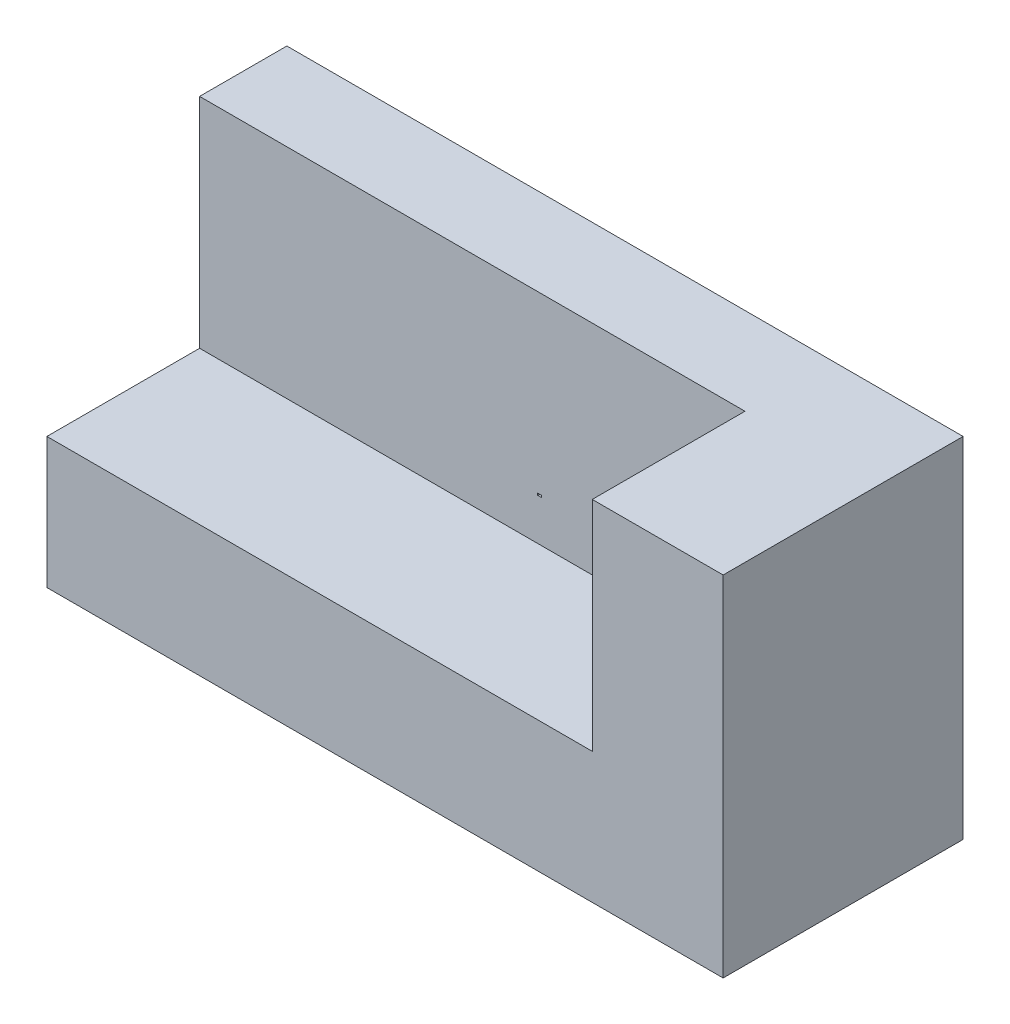
ISO-10303-21;
HEADER;
FILE_DESCRIPTION(('STEP AP214'),'2;1');
FILE_NAME('part.step','',(''),(''),'','','');
FILE_SCHEMA(('AUTOMOTIVE_DESIGN { 1 0 10303 214 1 1 1 1 }'));
ENDSEC;
DATA;
#1=APPLICATION_CONTEXT('core data for automotive mechanical design processes');
#2=APPLICATION_PROTOCOL_DEFINITION('international standard','automotive_design',2000,#1);
#3=PRODUCT_CONTEXT('',#1,'mechanical');
#4=PRODUCT('Part','Part','',(#3));
#5=PRODUCT_RELATED_PRODUCT_CATEGORY('part','',(#4));
#6=PRODUCT_DEFINITION_FORMATION('','',#4);
#7=PRODUCT_DEFINITION_CONTEXT('part definition',#1,'design');
#8=PRODUCT_DEFINITION('design','',#6,#7);
#9=PRODUCT_DEFINITION_SHAPE('','',#8);
#10=(LENGTH_UNIT() NAMED_UNIT(*) SI_UNIT(.MILLI.,.METRE.));
#11=(NAMED_UNIT(*) PLANE_ANGLE_UNIT() SI_UNIT($,.RADIAN.));
#12=(NAMED_UNIT(*) SI_UNIT($,.STERADIAN.) SOLID_ANGLE_UNIT());
#13=UNCERTAINTY_MEASURE_WITH_UNIT(LENGTH_MEASURE(1.E-05),#10,'distance_accuracy_value','');
#14=(GEOMETRIC_REPRESENTATION_CONTEXT(3) GLOBAL_UNCERTAINTY_ASSIGNED_CONTEXT((#13)) GLOBAL_UNIT_ASSIGNED_CONTEXT((#10,
#11,#12)) REPRESENTATION_CONTEXT('',''));
#15=CARTESIAN_POINT('',(0.,0.,0.));
#16=DIRECTION('',(0.,0.,1.));
#17=DIRECTION('',(1.,0.,0.));
#18=AXIS2_PLACEMENT_3D('',#15,#16,#17);
#19=CARTESIAN_POINT('',(0.,0.,22.));
#20=DIRECTION('',(0.,0.,-1.));
#21=DIRECTION('',(-1.,0.,0.));
#22=AXIS2_PLACEMENT_3D('',#19,#20,#21);
#23=PLANE('',#22);
#24=DIRECTION('',(1.,0.,0.));
#25=VECTOR('',#24,1.);
#26=CARTESIAN_POINT('',(0.,-4.00000000000001,22.));
#27=LINE('',#26,#25);
#28=CARTESIAN_POINT('',(-31.,-4.00000000000001,22.));
#29=VERTEX_POINT('',#28);
#30=CARTESIAN_POINT('',(19.,-4.00000000000001,22.));
#31=VERTEX_POINT('',#30);
#32=EDGE_CURVE('E210',#29,#31,#27,.T.);
#33=ORIENTED_EDGE('',*,*,#32,.F.);
#34=DIRECTION('',(0.,-1.,0.));
#35=VECTOR('',#34,1.);
#36=CARTESIAN_POINT('',(-31.,-16.,22.));
#37=LINE('',#36,#35);
#38=CARTESIAN_POINT('',(-31.,-16.,22.));
#39=VERTEX_POINT('',#38);
#40=EDGE_CURVE('E133',#29,#39,#37,.T.);
#41=ORIENTED_EDGE('',*,*,#40,.T.);
#42=DIRECTION('',(1.,0.,0.));
#43=VECTOR('',#42,1.);
#44=CARTESIAN_POINT('',(-31.,-16.,22.));
#45=LINE('',#44,#43);
#46=CARTESIAN_POINT('',(31.,-16.,22.));
#47=VERTEX_POINT('',#46);
#48=EDGE_CURVE('E138',#39,#47,#45,.T.);
#49=ORIENTED_EDGE('',*,*,#48,.T.);
#50=DIRECTION('',(0.,1.,0.));
#51=VECTOR('',#50,1.);
#52=CARTESIAN_POINT('',(31.,-16.,22.));
#53=LINE('',#52,#51);
#54=CARTESIAN_POINT('',(31.,16.,22.));
#55=VERTEX_POINT('',#54);
#56=EDGE_CURVE('E144',#47,#55,#53,.T.);
#57=ORIENTED_EDGE('',*,*,#56,.T.);
#58=DIRECTION('',(-1.,0.,0.));
#59=VECTOR('',#58,1.);
#60=CARTESIAN_POINT('',(-31.,16.,22.));
#61=LINE('',#60,#59);
#62=CARTESIAN_POINT('',(19.,16.,22.));
#63=VERTEX_POINT('',#62);
#64=EDGE_CURVE('E139',#55,#63,#61,.T.);
#65=ORIENTED_EDGE('',*,*,#64,.T.);
#66=DIRECTION('',(0.,1.,0.));
#67=VECTOR('',#66,1.);
#68=CARTESIAN_POINT('',(19.,0.,22.));
#69=LINE('',#68,#67);
#70=EDGE_CURVE('E212',#31,#63,#69,.T.);
#71=ORIENTED_EDGE('',*,*,#70,.F.);
#72=EDGE_LOOP('',(#33,#41,#49,#57,#65,#71));
#73=FACE_BOUND('',#72,.T.);
#74=ADVANCED_FACE('F33',(#73),#23,.F.);
#75=CARTESIAN_POINT('',(-31.,16.,22.));
#76=DIRECTION('',(0.,-1.,0.));
#77=DIRECTION('',(1.,0.,0.));
#78=AXIS2_PLACEMENT_3D('',#75,#76,#77);
#79=PLANE('',#78);
#80=DIRECTION('',(0.,0.,-1.));
#81=VECTOR('',#80,1.);
#82=CARTESIAN_POINT('',(19.,16.,22.000012));
#83=LINE('',#82,#81);
#84=CARTESIAN_POINT('',(19.,16.,8.));
#85=VERTEX_POINT('',#84);
#86=EDGE_CURVE('E202',#63,#85,#83,.T.);
#87=ORIENTED_EDGE('',*,*,#86,.F.);
#88=ORIENTED_EDGE('',*,*,#64,.F.);
#89=DIRECTION('',(0.,0.,-1.));
#90=VECTOR('',#89,1.);
#91=CARTESIAN_POINT('',(31.,16.,22.));
#92=LINE('',#91,#90);
#93=CARTESIAN_POINT('',(31.,16.,0.));
#94=VERTEX_POINT('',#93);
#95=EDGE_CURVE('E164',#55,#94,#92,.T.);
#96=ORIENTED_EDGE('',*,*,#95,.T.);
#97=DIRECTION('',(-1.,0.,0.));
#98=VECTOR('',#97,1.);
#99=CARTESIAN_POINT('',(-31.,16.,0.));
#100=LINE('',#99,#98);
#101=CARTESIAN_POINT('',(-31.,16.,0.));
#102=VERTEX_POINT('',#101);
#103=EDGE_CURVE('E151',#94,#102,#100,.T.);
#104=ORIENTED_EDGE('',*,*,#103,.T.);
#105=DIRECTION('',(0.,0.,-1.));
#106=VECTOR('',#105,1.);
#107=CARTESIAN_POINT('',(-31.,16.,22.));
#108=LINE('',#107,#106);
#109=CARTESIAN_POINT('',(-31.,16.,8.));
#110=VERTEX_POINT('',#109);
#111=EDGE_CURVE('E162',#110,#102,#108,.T.);
#112=ORIENTED_EDGE('',*,*,#111,.F.);
#113=DIRECTION('',(-1.,0.,0.));
#114=VECTOR('',#113,1.);
#115=CARTESIAN_POINT('',(-31.,16.,8.));
#116=LINE('',#115,#114);
#117=EDGE_CURVE('E48',#85,#110,#116,.T.);
#118=ORIENTED_EDGE('',*,*,#117,.F.);
#119=EDGE_LOOP('',(#87,#88,#96,#104,#112,#118));
#120=FACE_BOUND('',#119,.T.);
#121=ADVANCED_FACE('F200',(#120),#79,.F.);
#122=CARTESIAN_POINT('',(-31.,-16.,22.));
#123=DIRECTION('',(1.,0.,0.));
#124=DIRECTION('',(0.,0.,-1.));
#125=AXIS2_PLACEMENT_3D('',#122,#123,#124);
#126=PLANE('',#125);
#127=DIRECTION('',(0.,0.,1.));
#128=VECTOR('',#127,1.);
#129=CARTESIAN_POINT('',(-31.,-4.00000000000001,22.));
#130=LINE('',#129,#128);
#131=CARTESIAN_POINT('',(-31.,-4.00000000000001,8.));
#132=VERTEX_POINT('',#131);
#133=EDGE_CURVE('E11',#132,#29,#130,.T.);
#134=ORIENTED_EDGE('',*,*,#133,.F.);
#135=DIRECTION('',(0.,-1.,0.));
#136=VECTOR('',#135,1.);
#137=CARTESIAN_POINT('',(-31.,16.,8.));
#138=LINE('',#137,#136);
#139=EDGE_CURVE('E124',#110,#132,#138,.T.);
#140=ORIENTED_EDGE('',*,*,#139,.F.);
#141=ORIENTED_EDGE('',*,*,#111,.T.);
#142=DIRECTION('',(0.,-1.,0.));
#143=VECTOR('',#142,1.);
#144=CARTESIAN_POINT('',(-31.,-16.,0.));
#145=LINE('',#144,#143);
#146=CARTESIAN_POINT('',(-31.,-16.,0.));
#147=VERTEX_POINT('',#146);
#148=EDGE_CURVE('E155',#102,#147,#145,.T.);
#149=ORIENTED_EDGE('',*,*,#148,.T.);
#150=DIRECTION('',(0.,0.,-1.));
#151=VECTOR('',#150,1.);
#152=CARTESIAN_POINT('',(-31.,-16.,22.));
#153=LINE('',#152,#151);
#154=EDGE_CURVE('E135',#39,#147,#153,.T.);
#155=ORIENTED_EDGE('',*,*,#154,.F.);
#156=ORIENTED_EDGE('',*,*,#40,.F.);
#157=EDGE_LOOP('',(#134,#140,#141,#149,#155,#156));
#158=FACE_BOUND('',#157,.T.);
#159=ADVANCED_FACE('F131',(#158),#126,.F.);
#160=CARTESIAN_POINT('',(0.,0.,0.));
#161=DIRECTION('',(0.,0.,-1.));
#162=DIRECTION('',(-1.,0.,0.));
#163=AXIS2_PLACEMENT_3D('',#160,#161,#162);
#164=PLANE('',#163);
#165=DIRECTION('',(0.,1.,0.));
#166=VECTOR('',#165,1.);
#167=CARTESIAN_POINT('',(31.,-16.,0.));
#168=LINE('',#167,#166);
#169=CARTESIAN_POINT('',(31.,-16.,0.));
#170=VERTEX_POINT('',#169);
#171=EDGE_CURVE('E148',#170,#94,#168,.T.);
#172=ORIENTED_EDGE('',*,*,#171,.F.);
#173=DIRECTION('',(1.,0.,0.));
#174=VECTOR('',#173,1.);
#175=CARTESIAN_POINT('',(-31.,-16.,0.));
#176=LINE('',#175,#174);
#177=EDGE_CURVE('E157',#147,#170,#176,.T.);
#178=ORIENTED_EDGE('',*,*,#177,.F.);
#179=ORIENTED_EDGE('',*,*,#148,.F.);
#180=ORIENTED_EDGE('',*,*,#103,.F.);
#181=EDGE_LOOP('',(#172,#178,#179,#180));
#182=FACE_BOUND('',#181,.T.);
#183=DIRECTION('',(-1.,0.,0.));
#184=VECTOR('',#183,1.);
#185=CARTESIAN_POINT('',(0.346266540976304,0.,0.));
#186=LINE('',#185,#184);
#187=CARTESIAN_POINT('',(0.346266540976304,0.,0.));
#188=VERTEX_POINT('',#187);
#189=CARTESIAN_POINT('',(0.,0.,0.));
#190=VERTEX_POINT('',#189);
#191=EDGE_CURVE('E183',#188,#190,#186,.T.);
#192=ORIENTED_EDGE('',*,*,#191,.T.);
#193=DIRECTION('',(0.,-1.,0.));
#194=VECTOR('',#193,1.);
#195=CARTESIAN_POINT('',(0.,-0.178718214697451,0.));
#196=LINE('',#195,#194);
#197=CARTESIAN_POINT('',(0.,-0.178718214697451,0.));
#198=VERTEX_POINT('',#197);
#199=EDGE_CURVE('E214',#190,#198,#196,.T.);
#200=ORIENTED_EDGE('',*,*,#199,.T.);
#201=DIRECTION('',(1.,0.,0.));
#202=VECTOR('',#201,1.);
#203=CARTESIAN_POINT('',(0.346266540976304,-0.178718214697451,0.));
#204=LINE('',#203,#202);
#205=CARTESIAN_POINT('',(0.346266540976304,-0.178718214697451,0.));
#206=VERTEX_POINT('',#205);
#207=EDGE_CURVE('E217',#198,#206,#204,.T.);
#208=ORIENTED_EDGE('',*,*,#207,.T.);
#209=DIRECTION('',(0.,1.,0.));
#210=VECTOR('',#209,1.);
#211=CARTESIAN_POINT('',(0.346266540976304,-0.178718214697451,0.));
#212=LINE('',#211,#210);
#213=EDGE_CURVE('E220',#206,#188,#212,.T.);
#214=ORIENTED_EDGE('',*,*,#213,.T.);
#215=EDGE_LOOP('',(#192,#200,#208,#214));
#216=FACE_BOUND('',#215,.T.);
#217=ADVANCED_FACE('F222',(#182,#216),#164,.T.);
#218=CARTESIAN_POINT('',(31.,-16.,22.));
#219=DIRECTION('',(-1.,0.,0.));
#220=DIRECTION('',(0.,0.,1.));
#221=AXIS2_PLACEMENT_3D('',#218,#219,#220);
#222=PLANE('',#221);
#223=ORIENTED_EDGE('',*,*,#171,.T.);
#224=ORIENTED_EDGE('',*,*,#95,.F.);
#225=ORIENTED_EDGE('',*,*,#56,.F.);
#226=DIRECTION('',(0.,0.,-1.));
#227=VECTOR('',#226,1.);
#228=CARTESIAN_POINT('',(31.,-16.,22.));
#229=LINE('',#228,#227);
#230=EDGE_CURVE('E141',#47,#170,#229,.T.);
#231=ORIENTED_EDGE('',*,*,#230,.T.);
#232=EDGE_LOOP('',(#223,#224,#225,#231));
#233=FACE_BOUND('',#232,.T.);
#234=ADVANCED_FACE('F35',(#233),#222,.F.);
#235=CARTESIAN_POINT('',(-31.,-16.,22.));
#236=DIRECTION('',(0.,1.,0.));
#237=DIRECTION('',(0.,0.,1.));
#238=AXIS2_PLACEMENT_3D('',#235,#236,#237);
#239=PLANE('',#238);
#240=ORIENTED_EDGE('',*,*,#177,.T.);
#241=ORIENTED_EDGE('',*,*,#230,.F.);
#242=ORIENTED_EDGE('',*,*,#48,.F.);
#243=ORIENTED_EDGE('',*,*,#154,.T.);
#244=EDGE_LOOP('',(#240,#241,#242,#243));
#245=FACE_BOUND('',#244,.T.);
#246=ADVANCED_FACE('F231',(#245),#239,.F.);
#247=CARTESIAN_POINT('',(0.,-0.178718214697451,22.));
#248=DIRECTION('',(1.,0.,0.));
#249=DIRECTION('',(0.,1.,0.));
#250=AXIS2_PLACEMENT_3D('',#247,#248,#249);
#251=PLANE('',#250);
#252=DIRECTION('',(0.,1.,0.));
#253=VECTOR('',#252,1.);
#254=CARTESIAN_POINT('',(0.,-0.178718214697451,8.));
#255=LINE('',#254,#253);
#256=CARTESIAN_POINT('',(0.,-0.178718214697451,8.));
#257=VERTEX_POINT('',#256);
#258=CARTESIAN_POINT('',(0.,0.,8.));
#259=VERTEX_POINT('',#258);
#260=EDGE_CURVE('E56',#257,#259,#255,.T.);
#261=ORIENTED_EDGE('',*,*,#260,.F.);
#262=DIRECTION('',(0.,0.,-1.));
#263=VECTOR('',#262,1.);
#264=CARTESIAN_POINT('',(0.,-0.178718214697451,22.));
#265=LINE('',#264,#263);
#266=EDGE_CURVE('E152',#257,#198,#265,.T.);
#267=ORIENTED_EDGE('',*,*,#266,.T.);
#268=ORIENTED_EDGE('',*,*,#199,.F.);
#269=DIRECTION('',(0.,0.,-1.));
#270=VECTOR('',#269,1.);
#271=CARTESIAN_POINT('',(0.,0.,22.));
#272=LINE('',#271,#270);
#273=EDGE_CURVE('E185',#259,#190,#272,.T.);
#274=ORIENTED_EDGE('',*,*,#273,.F.);
#275=EDGE_LOOP('',(#261,#267,#268,#274));
#276=FACE_BOUND('',#275,.T.);
#277=ADVANCED_FACE('F229',(#276),#251,.T.);
#278=CARTESIAN_POINT('',(0.346266540976304,-0.178718214697451,22.));
#279=DIRECTION('',(0.,1.,0.));
#280=DIRECTION('',(-1.,0.,0.));
#281=AXIS2_PLACEMENT_3D('',#278,#279,#280);
#282=PLANE('',#281);
#283=DIRECTION('',(-1.,0.,0.));
#284=VECTOR('',#283,1.);
#285=CARTESIAN_POINT('',(0.346266540976304,-0.178718214697451,8.));
#286=LINE('',#285,#284);
#287=CARTESIAN_POINT('',(0.346266540976304,-0.178718214697451,8.));
#288=VERTEX_POINT('',#287);
#289=EDGE_CURVE('E179',#288,#257,#286,.T.);
#290=ORIENTED_EDGE('',*,*,#289,.F.);
#291=DIRECTION('',(0.,0.,-1.));
#292=VECTOR('',#291,1.);
#293=CARTESIAN_POINT('',(0.346266540976304,-0.178718214697451,22.));
#294=LINE('',#293,#292);
#295=EDGE_CURVE('E178',#288,#206,#294,.T.);
#296=ORIENTED_EDGE('',*,*,#295,.T.);
#297=ORIENTED_EDGE('',*,*,#207,.F.);
#298=ORIENTED_EDGE('',*,*,#266,.F.);
#299=EDGE_LOOP('',(#290,#296,#297,#298));
#300=FACE_BOUND('',#299,.T.);
#301=ADVANCED_FACE('F227',(#300),#282,.T.);
#302=CARTESIAN_POINT('',(0.346266540976304,-0.178718214697451,22.));
#303=DIRECTION('',(-1.,0.,0.));
#304=DIRECTION('',(0.,-1.,0.));
#305=AXIS2_PLACEMENT_3D('',#302,#303,#304);
#306=PLANE('',#305);
#307=DIRECTION('',(0.,-1.,0.));
#308=VECTOR('',#307,1.);
#309=CARTESIAN_POINT('',(0.346266540976304,-0.178718214697451,8.));
#310=LINE('',#309,#308);
#311=CARTESIAN_POINT('',(0.346266540976304,0.,8.));
#312=VERTEX_POINT('',#311);
#313=EDGE_CURVE('E167',#312,#288,#310,.T.);
#314=ORIENTED_EDGE('',*,*,#313,.F.);
#315=DIRECTION('',(0.,0.,-1.));
#316=VECTOR('',#315,1.);
#317=CARTESIAN_POINT('',(0.346266540976304,0.,22.));
#318=LINE('',#317,#316);
#319=EDGE_CURVE('E176',#312,#188,#318,.T.);
#320=ORIENTED_EDGE('',*,*,#319,.T.);
#321=ORIENTED_EDGE('',*,*,#213,.F.);
#322=ORIENTED_EDGE('',*,*,#295,.F.);
#323=EDGE_LOOP('',(#314,#320,#321,#322));
#324=FACE_BOUND('',#323,.T.);
#325=ADVANCED_FACE('F174',(#324),#306,.T.);
#326=CARTESIAN_POINT('',(0.346266540976304,0.,22.));
#327=DIRECTION('',(0.,-1.,0.));
#328=DIRECTION('',(1.,0.,0.));
#329=AXIS2_PLACEMENT_3D('',#326,#327,#328);
#330=PLANE('',#329);
#331=DIRECTION('',(1.,0.,0.));
#332=VECTOR('',#331,1.);
#333=CARTESIAN_POINT('',(0.346266540976304,0.,8.));
#334=LINE('',#333,#332);
#335=EDGE_CURVE('E41',#259,#312,#334,.T.);
#336=ORIENTED_EDGE('',*,*,#335,.F.);
#337=ORIENTED_EDGE('',*,*,#273,.T.);
#338=ORIENTED_EDGE('',*,*,#191,.F.);
#339=ORIENTED_EDGE('',*,*,#319,.F.);
#340=EDGE_LOOP('',(#336,#337,#338,#339));
#341=FACE_BOUND('',#340,.T.);
#342=ADVANCED_FACE('F181',(#341),#330,.T.);
#343=CARTESIAN_POINT('',(19.,16.,22.000012));
#344=DIRECTION('',(-1.,0.,0.));
#345=DIRECTION('',(0.,-1.,0.));
#346=AXIS2_PLACEMENT_3D('',#343,#344,#345);
#347=PLANE('',#346);
#348=ORIENTED_EDGE('',*,*,#70,.T.);
#349=ORIENTED_EDGE('',*,*,#86,.T.);
#350=DIRECTION('',(0.,1.,0.));
#351=VECTOR('',#350,1.);
#352=CARTESIAN_POINT('',(19.,16.,8.));
#353=LINE('',#352,#351);
#354=CARTESIAN_POINT('',(19.,-4.00000000000001,8.));
#355=VERTEX_POINT('',#354);
#356=EDGE_CURVE('E123',#355,#85,#353,.T.);
#357=ORIENTED_EDGE('',*,*,#356,.F.);
#358=DIRECTION('',(0.,0.,-1.));
#359=VECTOR('',#358,1.);
#360=CARTESIAN_POINT('',(19.,-4.00000000000001,22.000012));
#361=LINE('',#360,#359);
#362=EDGE_CURVE('E121',#31,#355,#361,.T.);
#363=ORIENTED_EDGE('',*,*,#362,.F.);
#364=EDGE_LOOP('',(#348,#349,#357,#363));
#365=FACE_BOUND('',#364,.T.);
#366=ADVANCED_FACE('F289',(#365),#347,.T.);
#367=CARTESIAN_POINT('',(-31.,-4.00000000000001,22.000012));
#368=DIRECTION('',(0.,1.,0.));
#369=DIRECTION('',(0.,0.,1.));
#370=AXIS2_PLACEMENT_3D('',#367,#368,#369);
#371=PLANE('',#370);
#372=ORIENTED_EDGE('',*,*,#32,.T.);
#373=ORIENTED_EDGE('',*,*,#362,.T.);
#374=DIRECTION('',(1.,0.,0.));
#375=VECTOR('',#374,1.);
#376=CARTESIAN_POINT('',(-31.,-4.00000000000001,8.));
#377=LINE('',#376,#375);
#378=EDGE_CURVE('E116',#132,#355,#377,.T.);
#379=ORIENTED_EDGE('',*,*,#378,.F.);
#380=ORIENTED_EDGE('',*,*,#133,.T.);
#381=EDGE_LOOP('',(#372,#373,#379,#380));
#382=FACE_BOUND('',#381,.T.);
#383=ADVANCED_FACE('F117',(#382),#371,.T.);
#384=CARTESIAN_POINT('',(0.,0.,8.));
#385=DIRECTION('',(0.,0.,-1.));
#386=DIRECTION('',(-1.,0.,0.));
#387=AXIS2_PLACEMENT_3D('',#384,#385,#386);
#388=PLANE('',#387);
#389=ORIENTED_EDGE('',*,*,#260,.T.);
#390=ORIENTED_EDGE('',*,*,#335,.T.);
#391=ORIENTED_EDGE('',*,*,#313,.T.);
#392=ORIENTED_EDGE('',*,*,#289,.T.);
#393=EDGE_LOOP('',(#389,#390,#391,#392));
#394=FACE_BOUND('',#393,.T.);
#395=ORIENTED_EDGE('',*,*,#117,.T.);
#396=ORIENTED_EDGE('',*,*,#139,.T.);
#397=ORIENTED_EDGE('',*,*,#378,.T.);
#398=ORIENTED_EDGE('',*,*,#356,.T.);
#399=EDGE_LOOP('',(#395,#396,#397,#398));
#400=FACE_BOUND('',#399,.T.);
#401=ADVANCED_FACE('F126',(#394,#400),#388,.F.);
#402=CLOSED_SHELL('',(#74,#121,#159,#217,#234,#246,#277,#301,#325,#342,#366,#383,#401));
#403=MANIFOLD_SOLID_BREP('B2',#402);
#404=ADVANCED_BREP_SHAPE_REPRESENTATION('',(#18,#403),#14);
#405=SHAPE_DEFINITION_REPRESENTATION(#9,#404);
ENDSEC;
END-ISO-10303-21;
